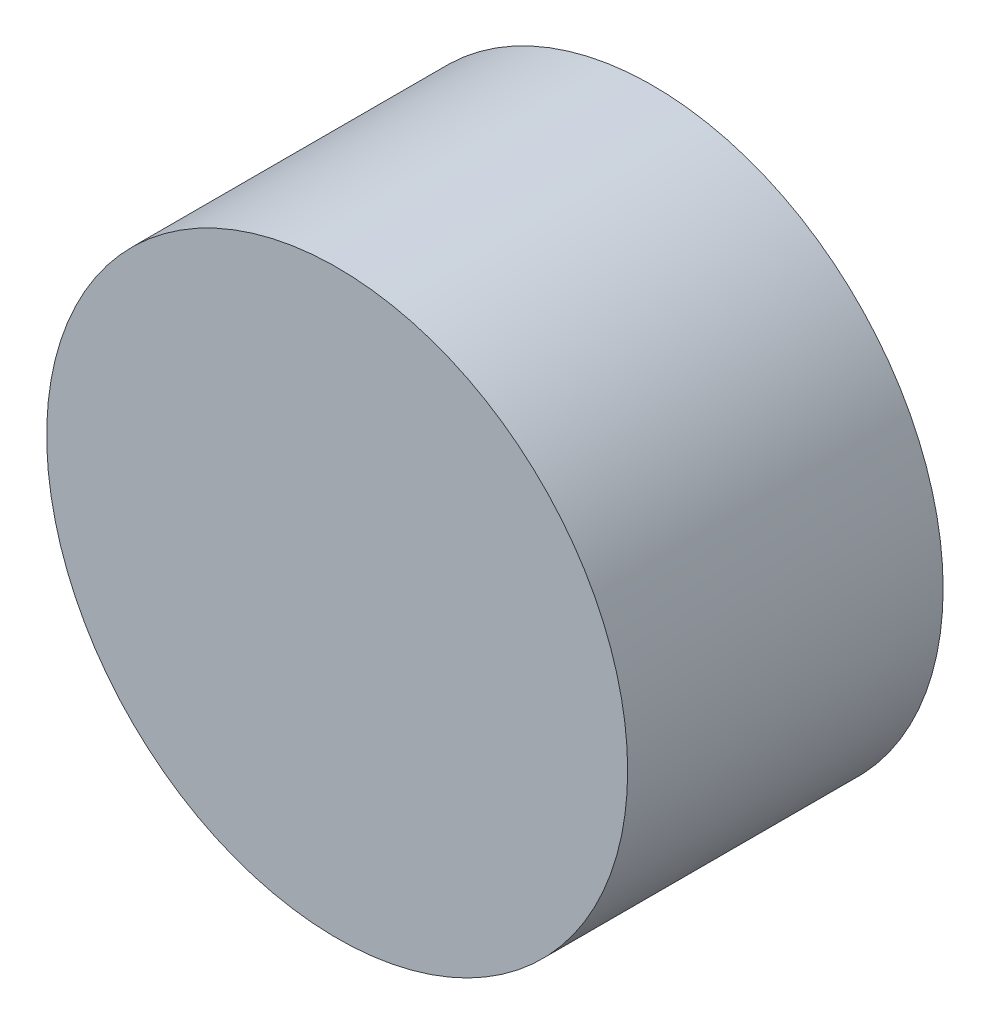
ISO-10303-21;
HEADER;
FILE_DESCRIPTION(('STEP AP214'),'2;1');
FILE_NAME('part.step','',(''),(''),'','','');
FILE_SCHEMA(('AUTOMOTIVE_DESIGN { 1 0 10303 214 1 1 1 1 }'));
ENDSEC;
DATA;
#1=APPLICATION_CONTEXT('core data for automotive mechanical design processes');
#2=APPLICATION_PROTOCOL_DEFINITION('international standard','automotive_design',2000,#1);
#3=PRODUCT_CONTEXT('',#1,'mechanical');
#4=PRODUCT('Part','Part','',(#3));
#5=PRODUCT_RELATED_PRODUCT_CATEGORY('part','',(#4));
#6=PRODUCT_DEFINITION_FORMATION('','',#4);
#7=PRODUCT_DEFINITION_CONTEXT('part definition',#1,'design');
#8=PRODUCT_DEFINITION('design','',#6,#7);
#9=PRODUCT_DEFINITION_SHAPE('','',#8);
#10=(LENGTH_UNIT() NAMED_UNIT(*) SI_UNIT(.MILLI.,.METRE.));
#11=(NAMED_UNIT(*) PLANE_ANGLE_UNIT() SI_UNIT($,.RADIAN.));
#12=(NAMED_UNIT(*) SI_UNIT($,.STERADIAN.) SOLID_ANGLE_UNIT());
#13=UNCERTAINTY_MEASURE_WITH_UNIT(LENGTH_MEASURE(1.E-05),#10,'distance_accuracy_value','');
#14=(GEOMETRIC_REPRESENTATION_CONTEXT(3) GLOBAL_UNCERTAINTY_ASSIGNED_CONTEXT((#13)) GLOBAL_UNIT_ASSIGNED_CONTEXT((#10,
#11,#12)) REPRESENTATION_CONTEXT('',''));
#15=CARTESIAN_POINT('',(0.,0.,0.));
#16=DIRECTION('',(0.,0.,1.));
#17=DIRECTION('',(1.,0.,0.));
#18=AXIS2_PLACEMENT_3D('',#15,#16,#17);
#19=CARTESIAN_POINT('',(0.,0.,55.1688));
#20=DIRECTION('',(0.,0.,-1.));
#21=DIRECTION('',(-1.,0.,0.));
#22=AXIS2_PLACEMENT_3D('',#19,#20,#21);
#23=CYLINDRICAL_SURFACE('',#22,50.8);
#24=CARTESIAN_POINT('',(0.,0.,55.1688));
#25=DIRECTION('',(0.,0.,1.));
#26=DIRECTION('',(1.,0.,0.));
#27=AXIS2_PLACEMENT_3D('',#24,#25,#26);
#28=CIRCLE('',#27,50.8);
#29=CARTESIAN_POINT('',(50.8,0.,55.1688));
#30=VERTEX_POINT('',#29);
#31=EDGE_CURVE('E10',#30,#30,#28,.T.);
#32=ORIENTED_EDGE('',*,*,#31,.F.);
#33=EDGE_LOOP('',(#32));
#34=FACE_BOUND('',#33,.T.);
#35=CARTESIAN_POINT('',(0.,0.,0.));
#36=DIRECTION('',(0.,0.,1.));
#37=DIRECTION('',(1.,0.,0.));
#38=AXIS2_PLACEMENT_3D('',#35,#36,#37);
#39=CIRCLE('',#38,50.8);
#40=CARTESIAN_POINT('',(50.8,0.,0.));
#41=VERTEX_POINT('',#40);
#42=EDGE_CURVE('E39',#41,#41,#39,.T.);
#43=ORIENTED_EDGE('',*,*,#42,.T.);
#44=EDGE_LOOP('',(#43));
#45=FACE_BOUND('',#44,.T.);
#46=ADVANCED_FACE('F36',(#34,#45),#23,.T.);
#47=CARTESIAN_POINT('',(0.,0.,55.1688));
#48=DIRECTION('',(0.,0.,1.));
#49=DIRECTION('',(1.,0.,0.));
#50=AXIS2_PLACEMENT_3D('',#47,#48,#49);
#51=PLANE('',#50);
#52=ORIENTED_EDGE('',*,*,#31,.T.);
#53=EDGE_LOOP('',(#52));
#54=FACE_BOUND('',#53,.T.);
#55=ADVANCED_FACE('F53',(#54),#51,.T.);
#56=CARTESIAN_POINT('',(0.,0.,0.));
#57=DIRECTION('',(0.,0.,1.));
#58=DIRECTION('',(1.,0.,0.));
#59=AXIS2_PLACEMENT_3D('',#56,#57,#58);
#60=PLANE('',#59);
#61=ORIENTED_EDGE('',*,*,#42,.F.);
#62=EDGE_LOOP('',(#61));
#63=FACE_BOUND('',#62,.T.);
#64=ADVANCED_FACE('F51',(#63),#60,.F.);
#65=CLOSED_SHELL('',(#46,#55,#64));
#66=MANIFOLD_SOLID_BREP('B2',#65);
#67=ADVANCED_BREP_SHAPE_REPRESENTATION('',(#18,#66),#14);
#68=SHAPE_DEFINITION_REPRESENTATION(#9,#67);
ENDSEC;
END-ISO-10303-21;
